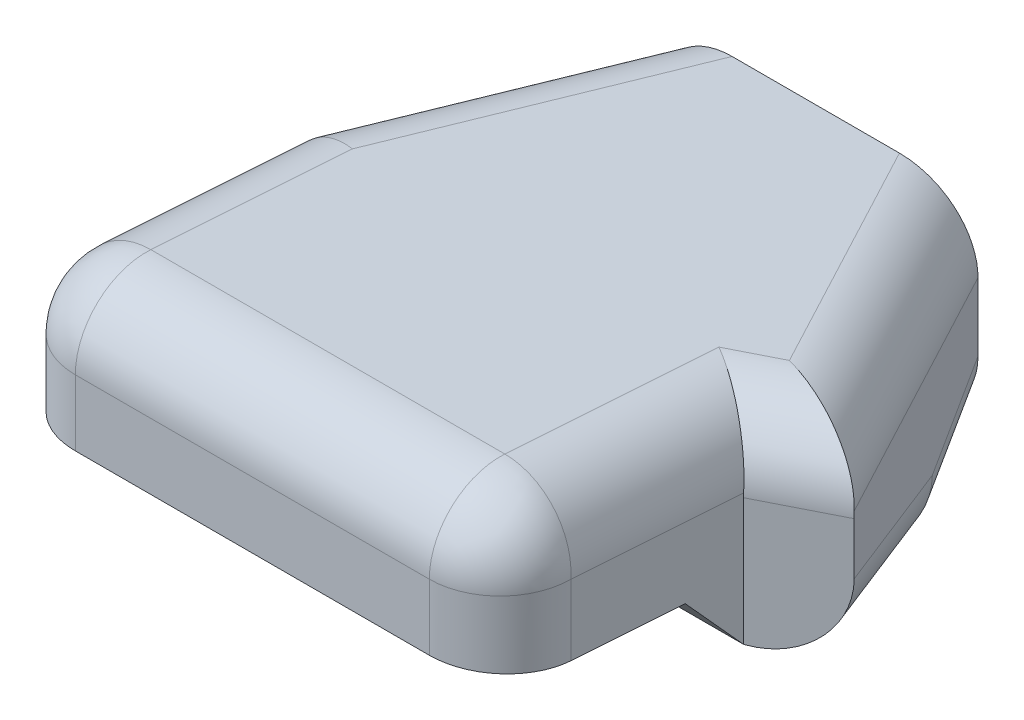
ISO-10303-21;
HEADER;
FILE_DESCRIPTION(('STEP AP214'),'2;1');
FILE_NAME('part.step','',(''),(''),'','','');
FILE_SCHEMA(('AUTOMOTIVE_DESIGN { 1 0 10303 214 1 1 1 1 }'));
ENDSEC;
DATA;
#1=APPLICATION_CONTEXT('core data for automotive mechanical design processes');
#2=APPLICATION_PROTOCOL_DEFINITION('international standard','automotive_design',2000,#1);
#3=PRODUCT_CONTEXT('',#1,'mechanical');
#4=PRODUCT('Part','Part','',(#3));
#5=PRODUCT_RELATED_PRODUCT_CATEGORY('part','',(#4));
#6=PRODUCT_DEFINITION_FORMATION('','',#4);
#7=PRODUCT_DEFINITION_CONTEXT('part definition',#1,'design');
#8=PRODUCT_DEFINITION('design','',#6,#7);
#9=PRODUCT_DEFINITION_SHAPE('','',#8);
#10=(LENGTH_UNIT() NAMED_UNIT(*) SI_UNIT(.MILLI.,.METRE.));
#11=(NAMED_UNIT(*) PLANE_ANGLE_UNIT() SI_UNIT($,.RADIAN.));
#12=(NAMED_UNIT(*) SI_UNIT($,.STERADIAN.) SOLID_ANGLE_UNIT());
#13=UNCERTAINTY_MEASURE_WITH_UNIT(LENGTH_MEASURE(1.E-05),#10,'distance_accuracy_value','');
#14=(GEOMETRIC_REPRESENTATION_CONTEXT(3) GLOBAL_UNCERTAINTY_ASSIGNED_CONTEXT((#13)) GLOBAL_UNIT_ASSIGNED_CONTEXT((#10,
#11,#12)) REPRESENTATION_CONTEXT('',''));
#15=CARTESIAN_POINT('',(0.,0.,0.));
#16=DIRECTION('',(0.,0.,1.));
#17=DIRECTION('',(1.,0.,0.));
#18=AXIS2_PLACEMENT_3D('',#15,#16,#17);
#19=CARTESIAN_POINT('',(-44.45,48.26,50.8));
#20=DIRECTION('',(1.,0.,0.));
#21=DIRECTION('',(0.,0.,1.));
#22=AXIS2_PLACEMENT_3D('',#19,#20,#21);
#23=PLANE('',#22);
#24=DIRECTION('',(0.,0.741365955623749,0.671100975891173));
#25=VECTOR('',#24,1.);
#26=CARTESIAN_POINT('',(-44.45,27.062088622232,74.2173550484524));
#27=LINE('',#26,#25);
#28=CARTESIAN_POINT('',(-44.45,15.2004808970908,63.4799635353998));
#29=VERTEX_POINT('',#28);
#30=CARTESIAN_POINT('',(-44.45,20.6329834358397,68.3975858346573));
#31=VERTEX_POINT('',#30);
#32=EDGE_CURVE('E330',#29,#31,#27,.T.);
#33=ORIENTED_EDGE('',*,*,#32,.T.);
#34=DIRECTION('',(0.,0.0669235621427186,0.997758105369297));
#35=VECTOR('',#34,1.);
#36=CARTESIAN_POINT('',(-44.45,19.5816654348561,52.7235687438587));
#37=LINE('',#36,#35);
#38=CARTESIAN_POINT('',(-44.45,22.008161027569,88.9));
#39=VERTEX_POINT('',#38);
#40=EDGE_CURVE('E327',#31,#39,#37,.T.);
#41=ORIENTED_EDGE('',*,*,#40,.T.);
#42=DIRECTION('',(0.,-1.,0.));
#43=VECTOR('',#42,1.);
#44=CARTESIAN_POINT('',(-44.45,48.26,88.9));
#45=LINE('',#44,#43);
#46=CARTESIAN_POINT('',(-44.45,34.6796249909718,88.9));
#47=VERTEX_POINT('',#46);
#48=EDGE_CURVE('E383',#47,#39,#45,.T.);
#49=ORIENTED_EDGE('',*,*,#48,.F.);
#50=DIRECTION('',(0.,-0.0669235621427186,-0.997758105369297));
#51=VECTOR('',#50,1.);
#52=CARTESIAN_POINT('',(-44.45,35.5884720618099,102.449929239213));
#53=LINE('',#52,#51);
#54=CARTESIAN_POINT('',(-44.45,32.1241080736787,50.8));
#55=VERTEX_POINT('',#54);
#56=EDGE_CURVE('E380',#55,#47,#53,.F.);
#57=ORIENTED_EDGE('',*,*,#56,.F.);
#58=DIRECTION('',(0.,-1.,0.));
#59=VECTOR('',#58,1.);
#60=CARTESIAN_POINT('',(-44.45,48.26,50.8));
#61=LINE('',#60,#59);
#62=CARTESIAN_POINT('',(-44.45,21.3334287185706,50.8));
#63=VERTEX_POINT('',#62);
#64=EDGE_CURVE('E345',#55,#63,#61,.T.);
#65=ORIENTED_EDGE('',*,*,#64,.T.);
#66=CARTESIAN_POINT('',(-44.45,32.1617140550632,93.3781587201701));
#67=DIRECTION('',(-1.,0.,0.));
#68=DIRECTION('',(0.,-0.268871544476507,-0.963176044433632));
#69=AXIS2_PLACEMENT_3D('',#66,#67,#68);
#70=ELLIPSE('',#69,44.0636100522988,12.7);
#71=EDGE_CURVE('E438',#29,#63,#70,.F.);
#72=ORIENTED_EDGE('',*,*,#71,.F.);
#73=EDGE_LOOP('',(#33,#41,#49,#57,#65,#72));
#74=FACE_BOUND('',#73,.T.);
#75=ADVANCED_FACE('F47',(#74),#23,.F.);
#76=CARTESIAN_POINT('',(-28.575,48.26,0.));
#77=DIRECTION('',(0.95447997803503,0.,0.298274993135947));
#78=DIRECTION('',(-0.298274993135947,0.,0.95447997803503));
#79=AXIS2_PLACEMENT_3D('',#76,#77,#78);
#80=PLANE('',#79);
#81=ORIENTED_EDGE('',*,*,#64,.F.);
#82=CARTESIAN_POINT('',(-31.75,29.3982233618993,10.16));
#83=DIRECTION('',(-0.95447997803503,0.,-0.298274993135947));
#84=DIRECTION('',(-0.297541229968866,0.0700998795093561,0.952131935900371));
#85=AXIS2_PLACEMENT_3D('',#82,#83,#84);
#86=ELLIPSE('',#85,42.6738289481605,12.7);
#87=CARTESIAN_POINT('',(-44.4474694857825,32.3776471963871,50.791902354504));
#88=VERTEX_POINT('',#87);
#89=EDGE_CURVE('E408',#88,#55,#86,.F.);
#90=ORIENTED_EDGE('',*,*,#89,.F.);
#91=DIRECTION('',(0.297665602820913,-0.0638899303899297,-0.952529929026922));
#92=VECTOR('',#91,1.);
#93=CARTESIAN_POINT('',(-44.6872370991244,32.4291100996618,51.5591587171979));
#94=LINE('',#93,#92);
#95=CARTESIAN_POINT('',(-28.575,28.9708344476093,0.));
#96=VERTEX_POINT('',#95);
#97=EDGE_CURVE('E405',#96,#88,#94,.F.);
#98=ORIENTED_EDGE('',*,*,#97,.F.);
#99=DIRECTION('',(0.,-1.,0.));
#100=VECTOR('',#99,1.);
#101=CARTESIAN_POINT('',(-28.575,48.26,0.));
#102=LINE('',#101,#100);
#103=CARTESIAN_POINT('',(-28.575,17.4265217154074,0.));
#104=VERTEX_POINT('',#103);
#105=EDGE_CURVE('E342',#96,#104,#102,.T.);
#106=ORIENTED_EDGE('',*,*,#105,.T.);
#107=DIRECTION('',(-0.292654151843761,-0.193219752801737,0.936493285900035));
#108=VECTOR('',#107,1.);
#109=CARTESIAN_POINT('',(-29.2640722899567,16.971573864201,2.2050313278613));
#110=LINE('',#109,#108);
#111=CARTESIAN_POINT('',(-35.1883635531592,13.0601648300568,21.1627633701095));
#112=VERTEX_POINT('',#111);
#113=EDGE_CURVE('E441',#112,#104,#110,.F.);
#114=ORIENTED_EDGE('',*,*,#113,.F.);
#115=DIRECTION('',(-0.288219689329278,0.257461795372023,0.922303005853689));
#116=VECTOR('',#115,1.);
#117=CARTESIAN_POINT('',(-35.4555907010625,13.29887434165,22.0178902434001));
#118=LINE('',#117,#116);
#119=EDGE_CURVE('E444',#63,#112,#118,.F.);
#120=ORIENTED_EDGE('',*,*,#119,.F.);
#121=EDGE_LOOP('',(#81,#90,#98,#106,#114,#120));
#122=FACE_BOUND('',#121,.T.);
#123=ADVANCED_FACE('F507',(#122),#80,.F.);
#124=CARTESIAN_POINT('',(28.575,48.26,0.));
#125=DIRECTION('',(0.,0.,1.));
#126=DIRECTION('',(-1.,0.,0.));
#127=AXIS2_PLACEMENT_3D('',#124,#125,#126);
#128=PLANE('',#127);
#129=DIRECTION('',(0.,1.,0.));
#130=VECTOR('',#129,1.);
#131=CARTESIAN_POINT('',(-10.4193083176777,18.3429414445207,0.));
#132=LINE('',#131,#130);
#133=CARTESIAN_POINT('',(-10.4193083176777,18.3429414445207,0.));
#134=VERTEX_POINT('',#133);
#135=CARTESIAN_POINT('',(-10.4193083176777,28.3429414445207,0.));
#136=VERTEX_POINT('',#135);
#137=EDGE_CURVE('E247',#134,#136,#132,.T.);
#138=ORIENTED_EDGE('',*,*,#137,.F.);
#139=DIRECTION('',(-1.,0.,0.));
#140=VECTOR('',#139,1.);
#141=CARTESIAN_POINT('',(9.58069168232234,18.3429414445207,0.));
#142=LINE('',#141,#140);
#143=CARTESIAN_POINT('',(-9.89583157885465,18.3429414445207,0.));
#144=VERTEX_POINT('',#143);
#145=EDGE_CURVE('E260',#144,#134,#142,.T.);
#146=ORIENTED_EDGE('',*,*,#145,.F.);
#147=DIRECTION('',(0.,1.,0.));
#148=VECTOR('',#147,1.);
#149=CARTESIAN_POINT('',(-9.89583157885465,0.,0.));
#150=LINE('',#149,#148);
#151=CARTESIAN_POINT('',(-9.89583157885465,18.3063755872149,0.));
#152=VERTEX_POINT('',#151);
#153=EDGE_CURVE('E282',#152,#144,#150,.T.);
#154=ORIENTED_EDGE('',*,*,#153,.F.);
#155=DIRECTION('',(1.,0.,0.));
#156=VECTOR('',#155,1.);
#157=CARTESIAN_POINT('',(0.,18.3063755872149,0.));
#158=LINE('',#157,#156);
#159=CARTESIAN_POINT('',(10.1041684211454,18.3063755872149,0.));
#160=VERTEX_POINT('',#159);
#161=EDGE_CURVE('E278',#152,#160,#158,.T.);
#162=ORIENTED_EDGE('',*,*,#161,.T.);
#163=DIRECTION('',(0.,1.,0.));
#164=VECTOR('',#163,1.);
#165=CARTESIAN_POINT('',(10.1041684211454,0.,0.));
#166=LINE('',#165,#164);
#167=CARTESIAN_POINT('',(10.1041684211454,28.3063755872149,0.));
#168=VERTEX_POINT('',#167);
#169=EDGE_CURVE('E290',#160,#168,#166,.T.);
#170=ORIENTED_EDGE('',*,*,#169,.T.);
#171=DIRECTION('',(1.,0.,0.));
#172=VECTOR('',#171,1.);
#173=CARTESIAN_POINT('',(0.,28.3063755872149,0.));
#174=LINE('',#173,#172);
#175=CARTESIAN_POINT('',(9.58069168232234,28.3063755872149,0.));
#176=VERTEX_POINT('',#175);
#177=EDGE_CURVE('E293',#176,#168,#174,.T.);
#178=ORIENTED_EDGE('',*,*,#177,.F.);
#179=DIRECTION('',(0.,-1.,0.));
#180=VECTOR('',#179,1.);
#181=CARTESIAN_POINT('',(9.58069168232234,18.3429414445207,0.));
#182=LINE('',#181,#180);
#183=CARTESIAN_POINT('',(9.58069168232234,28.3429414445207,0.));
#184=VERTEX_POINT('',#183);
#185=EDGE_CURVE('E262',#184,#176,#182,.T.);
#186=ORIENTED_EDGE('',*,*,#185,.F.);
#187=DIRECTION('',(1.,0.,0.));
#188=VECTOR('',#187,1.);
#189=CARTESIAN_POINT('',(9.58069168232234,28.3429414445207,0.));
#190=LINE('',#189,#188);
#191=EDGE_CURVE('E268',#136,#184,#190,.T.);
#192=ORIENTED_EDGE('',*,*,#191,.F.);
#193=EDGE_LOOP('',(#138,#146,#154,#162,#170,#178,#186,#192));
#194=FACE_BOUND('',#193,.T.);
#195=ORIENTED_EDGE('',*,*,#105,.F.);
#196=CARTESIAN_POINT('',(-15.2693253999468,28.7167521839545,0.));
#197=DIRECTION('',(0.,0.,-1.));
#198=DIRECTION('',(-0.977732072803991,0.209857079486041,0.));
#199=AXIS2_PLACEMENT_3D('',#196,#197,#198);
#200=ELLIPSE('',#199,13.3329143924895,12.7);
#201=CARTESIAN_POINT('',(-15.5349282872007,41.4452882205517,0.));
#202=VERTEX_POINT('',#201);
#203=EDGE_CURVE('E373',#202,#96,#200,.F.);
#204=ORIENTED_EDGE('',*,*,#203,.F.);
#205=DIRECTION('',(-1.,0.,0.));
#206=VECTOR('',#205,1.);
#207=CARTESIAN_POINT('',(82.55,41.4452882205517,0.));
#208=LINE('',#207,#206);
#209=CARTESIAN_POINT('',(14.4817721449502,41.4452882205517,0.));
#210=VERTEX_POINT('',#209);
#211=EDGE_CURVE('E318',#210,#202,#208,.T.);
#212=ORIENTED_EDGE('',*,*,#211,.F.);
#213=CARTESIAN_POINT('',(14.0036869478931,28.7167521839545,0.));
#214=DIRECTION('',(0.,0.,-1.));
#215=DIRECTION('',(-0.992965534941179,-0.118403743264215,0.));
#216=AXIS2_PLACEMENT_3D('',#213,#214,#215);
#217=ELLIPSE('',#216,14.5961910681332,12.7);
#218=CARTESIAN_POINT('',(28.575,29.1343758145459,0.));
#219=VERTEX_POINT('',#218);
#220=EDGE_CURVE('E375',#219,#210,#217,.F.);
#221=ORIENTED_EDGE('',*,*,#220,.F.);
#222=DIRECTION('',(0.,-1.,0.));
#223=VECTOR('',#222,1.);
#224=CARTESIAN_POINT('',(28.575,48.26,0.));
#225=LINE('',#224,#223);
#226=CARTESIAN_POINT('',(28.575,16.9234606655006,0.));
#227=VERTEX_POINT('',#226);
#228=EDGE_CURVE('E339',#219,#227,#225,.T.);
#229=ORIENTED_EDGE('',*,*,#228,.T.);
#230=CARTESIAN_POINT('',(14.0036869478931,18.2080908847934,0.));
#231=DIRECTION('',(0.,0.,-1.));
#232=DIRECTION('',(0.938837131961839,-0.344361495596806,0.));
#233=AXIS2_PLACEMENT_3D('',#230,#231,#232);
#234=ELLIPSE('',#233,14.8050370544065,12.7);
#235=CARTESIAN_POINT('',(15.4471999259788,5.24059466848969,0.));
#236=VERTEX_POINT('',#235);
#237=EDGE_CURVE('E458',#236,#227,#234,.F.);
#238=ORIENTED_EDGE('',*,*,#237,.F.);
#239=DIRECTION('',(-1.,0.,0.));
#240=VECTOR('',#239,1.);
#241=CARTESIAN_POINT('',(82.55,5.24059466848969,0.));
#242=LINE('',#241,#240);
#243=CARTESIAN_POINT('',(-16.0712770544389,5.24059466848969,0.));
#244=VERTEX_POINT('',#243);
#245=EDGE_CURVE('E303',#236,#244,#242,.T.);
#246=ORIENTED_EDGE('',*,*,#245,.T.);
#247=CARTESIAN_POINT('',(-15.2693253999468,18.2080908847934,0.));
#248=DIRECTION('',(0.,0.,-1.));
#249=DIRECTION('',(0.834520233187556,0.550977295721509,0.));
#250=AXIS2_PLACEMENT_3D('',#247,#248,#249);
#251=ELLIPSE('',#250,13.5612290992502,12.7);
#252=EDGE_CURVE('E461',#104,#244,#251,.F.);
#253=ORIENTED_EDGE('',*,*,#252,.F.);
#254=EDGE_LOOP('',(#195,#204,#212,#221,#229,#238,#246,#253));
#255=FACE_BOUND('',#254,.T.);
#256=ADVANCED_FACE('F483',(#194,#255),#128,.F.);
#257=CARTESIAN_POINT('',(57.15,48.26,50.8));
#258=DIRECTION('',(-0.871575537124549,0.,0.490261239632559));
#259=DIRECTION('',(-0.490261239632559,0.,-0.871575537124549));
#260=AXIS2_PLACEMENT_3D('',#257,#258,#259);
#261=PLANE('',#260);
#262=DIRECTION('',(-0.482521588682802,0.176986881195609,-0.857816157658315));
#263=VECTOR('',#262,1.);
#264=CARTESIAN_POINT('',(43.8602166520565,11.3169077420727,27.1737184925448));
#265=LINE('',#264,#263);
#266=CARTESIAN_POINT('',(39.1075526472764,13.0601648300568,18.7245380396025));
#267=VERTEX_POINT('',#266);
#268=EDGE_CURVE('E464',#227,#267,#265,.F.);
#269=ORIENTED_EDGE('',*,*,#268,.F.);
#270=ORIENTED_EDGE('',*,*,#228,.F.);
#271=DIRECTION('',(0.489425629375078,0.0583603604840991,0.870090007777917));
#272=VECTOR('',#271,1.);
#273=CARTESIAN_POINT('',(28.9266372824396,29.1763059410679,0.625132946559234));
#274=LINE('',#273,#272);
#275=CARTESIAN_POINT('',(57.1241369132409,32.5386477238328,50.754021179095));
#276=VERTEX_POINT('',#275);
#277=EDGE_CURVE('E371',#276,#219,#274,.F.);
#278=ORIENTED_EDGE('',*,*,#277,.F.);
#279=CARTESIAN_POINT('',(50.9236822566665,31.3816660637385,39.7309906785182));
#280=DIRECTION('',(0.871575537124549,0.,-0.490261239632559));
#281=DIRECTION('',(0.,-1.,0.));
#282=AXIS2_PLACEMENT_3D('',#279,#280,#281);
#283=ELLIPSE('',#282,12.7068646603648,12.7);
#284=CARTESIAN_POINT('',(57.15,31.3816660637385,50.8));
#285=VERTEX_POINT('',#284);
#286=EDGE_CURVE('E368',#285,#276,#283,.F.);
#287=ORIENTED_EDGE('',*,*,#286,.F.);
#288=DIRECTION('',(0.,-1.,0.));
#289=VECTOR('',#288,1.);
#290=CARTESIAN_POINT('',(57.15,48.26,50.8));
#291=LINE('',#290,#289);
#292=CARTESIAN_POINT('',(57.15,22.0140617286873,50.8));
#293=VERTEX_POINT('',#292);
#294=EDGE_CURVE('E336',#285,#293,#291,.T.);
#295=ORIENTED_EDGE('',*,*,#294,.T.);
#296=DIRECTION('',(-0.476364625502872,-0.23640472157252,-0.84687044533844));
#297=VECTOR('',#296,1.);
#298=CARTESIAN_POINT('',(55.4693780752367,21.1800221360687,47.8122276893097));
#299=LINE('',#298,#297);
#300=EDGE_CURVE('E56',#267,#293,#299,.F.);
#301=ORIENTED_EDGE('',*,*,#300,.F.);
#302=EDGE_LOOP('',(#269,#270,#278,#287,#295,#301));
#303=FACE_BOUND('',#302,.T.);
#304=ADVANCED_FACE('F489',(#303),#261,.F.);
#305=CARTESIAN_POINT('',(57.15,48.26,50.8));
#306=DIRECTION('',(-0.490261239632559,0.,-0.871575537124549));
#307=DIRECTION('',(0.871575537124549,0.,-0.490261239632559));
#308=AXIS2_PLACEMENT_3D('',#305,#306,#307);
#309=PLANE('',#308);
#310=ORIENTED_EDGE('',*,*,#294,.F.);
#311=DIRECTION('',(-0.871104683754771,0.0328659855718789,0.489996384612059));
#312=VECTOR('',#311,1.);
#313=CARTESIAN_POINT('',(56.76432975166,31.3962170506104,51.0169395146912));
#314=LINE('',#313,#312);
#315=CARTESIAN_POINT('',(44.45,31.8608254857309,57.94375));
#316=VERTEX_POINT('',#315);
#317=EDGE_CURVE('E378',#316,#285,#314,.F.);
#318=ORIENTED_EDGE('',*,*,#317,.F.);
#319=DIRECTION('',(0.,-1.,0.));
#320=VECTOR('',#319,1.);
#321=CARTESIAN_POINT('',(44.45,48.26,57.94375));
#322=LINE('',#321,#320);
#323=CARTESIAN_POINT('',(44.45,9.08461996758088,57.94375));
#324=VERTEX_POINT('',#323);
#325=EDGE_CURVE('E333',#316,#324,#322,.T.);
#326=ORIENTED_EDGE('',*,*,#325,.T.);
#327=DIRECTION('',(0.863526210364251,-0.13559298459543,-0.485733493329891));
#328=VECTOR('',#327,1.);
#329=CARTESIAN_POINT('',(52.329534026568,7.84735638129908,53.5115121100555));
#330=LINE('',#329,#328);
#331=CARTESIAN_POINT('',(44.6219037926469,9.0576272161988,57.8470541166361));
#332=VERTEX_POINT('',#331);
#333=EDGE_CURVE('E306',#324,#332,#330,.T.);
#334=ORIENTED_EDGE('',*,*,#333,.T.);
#335=CARTESIAN_POINT('',(46.0809906785182,22.0140617286873,57.0263177433335));
#336=DIRECTION('',(0.490261239632559,0.,0.871575537124549));
#337=DIRECTION('',(0.,1.,0.));
#338=AXIS2_PLACEMENT_3D('',#335,#336,#337);
#339=ELLIPSE('',#338,13.0704872066449,12.7);
#340=EDGE_CURVE('E11',#293,#332,#339,.F.);
#341=ORIENTED_EDGE('',*,*,#340,.F.);
#342=EDGE_LOOP('',(#310,#318,#326,#334,#341));
#343=FACE_BOUND('',#342,.T.);
#344=ADVANCED_FACE('F494',(#343),#309,.F.);
#345=CARTESIAN_POINT('',(44.45,48.26,57.94375));
#346=DIRECTION('',(-1.,0.,0.));
#347=DIRECTION('',(0.,0.,-1.));
#348=AXIS2_PLACEMENT_3D('',#345,#346,#347);
#349=PLANE('',#348);
#350=DIRECTION('',(0.,-0.0669235621427186,-0.997758105369297));
#351=VECTOR('',#350,1.);
#352=CARTESIAN_POINT('',(44.45,20.0586788152768,59.835323579464));
#353=LINE('',#352,#351);
#354=CARTESIAN_POINT('',(44.45,22.008161027569,88.9));
#355=VERTEX_POINT('',#354);
#356=CARTESIAN_POINT('',(44.45,20.6329834358397,68.3975858346573));
#357=VERTEX_POINT('',#356);
#358=EDGE_CURVE('E324',#355,#357,#353,.T.);
#359=ORIENTED_EDGE('',*,*,#358,.T.);
#360=DIRECTION('',(0.,-0.741365955623749,-0.671100975891173));
#361=VECTOR('',#360,1.);
#362=CARTESIAN_POINT('',(44.45,30.616328677508,77.4347323120743));
#363=LINE('',#362,#361);
#364=EDGE_CURVE('E348',#357,#324,#363,.T.);
#365=ORIENTED_EDGE('',*,*,#364,.T.);
#366=ORIENTED_EDGE('',*,*,#325,.F.);
#367=CARTESIAN_POINT('',(44.45,31.6259121935233,43.3724369478931));
#368=DIRECTION('',(1.,0.,0.));
#369=DIRECTION('',(0.,-0.0669235621427186,-0.997758105369297));
#370=AXIS2_PLACEMENT_3D('',#367,#368,#369);
#371=ELLIPSE('',#370,14.5791892029078,12.7);
#372=CARTESIAN_POINT('',(44.45,32.6016034681345,57.9189411448069));
#373=VERTEX_POINT('',#372);
#374=EDGE_CURVE('E410',#373,#316,#371,.T.);
#375=ORIENTED_EDGE('',*,*,#374,.F.);
#376=DIRECTION('',(0.,0.0669235621427186,0.997758105369297));
#377=VECTOR('',#376,1.);
#378=CARTESIAN_POINT('',(44.45,32.6602755940782,58.7936792392125));
#379=LINE('',#378,#377);
#380=CARTESIAN_POINT('',(44.45,34.6796249909718,88.9));
#381=VERTEX_POINT('',#380);
#382=EDGE_CURVE('E399',#381,#373,#379,.F.);
#383=ORIENTED_EDGE('',*,*,#382,.F.);
#384=DIRECTION('',(0.,-1.,0.));
#385=VECTOR('',#384,1.);
#386=CARTESIAN_POINT('',(44.45,48.26,88.9));
#387=LINE('',#386,#385);
#388=EDGE_CURVE('E402',#355,#381,#387,.F.);
#389=ORIENTED_EDGE('',*,*,#388,.F.);
#390=EDGE_LOOP('',(#359,#365,#366,#375,#383,#389));
#391=FACE_BOUND('',#390,.T.);
#392=ADVANCED_FACE('F523',(#391),#349,.F.);
#393=CARTESIAN_POINT('',(-44.45,48.26,101.6));
#394=DIRECTION('',(0.,0.,-1.));
#395=DIRECTION('',(1.,0.,0.));
#396=AXIS2_PLACEMENT_3D('',#393,#394,#395);
#397=PLANE('',#396);
#398=DIRECTION('',(-1.,0.,0.));
#399=VECTOR('',#398,1.);
#400=CARTESIAN_POINT('',(82.55,22.86,101.6));
#401=LINE('',#400,#399);
#402=CARTESIAN_POINT('',(31.75,22.86,101.6));
#403=VERTEX_POINT('',#402);
#404=CARTESIAN_POINT('',(-31.75,22.86,101.6));
#405=VERTEX_POINT('',#404);
#406=EDGE_CURVE('E315',#403,#405,#401,.T.);
#407=ORIENTED_EDGE('',*,*,#406,.F.);
#408=DIRECTION('',(0.,-1.,0.));
#409=VECTOR('',#408,1.);
#410=CARTESIAN_POINT('',(31.75,48.26,101.6));
#411=LINE('',#410,#409);
#412=CARTESIAN_POINT('',(31.75,34.6796249909718,101.6));
#413=VERTEX_POINT('',#412);
#414=EDGE_CURVE('E393',#413,#403,#411,.T.);
#415=ORIENTED_EDGE('',*,*,#414,.F.);
#416=DIRECTION('',(-1.,0.,0.));
#417=VECTOR('',#416,1.);
#418=CARTESIAN_POINT('',(44.45,34.6796249909718,101.6));
#419=LINE('',#418,#417);
#420=CARTESIAN_POINT('',(-31.75,34.6796249909718,101.6));
#421=VERTEX_POINT('',#420);
#422=EDGE_CURVE('E390',#421,#413,#419,.F.);
#423=ORIENTED_EDGE('',*,*,#422,.F.);
#424=DIRECTION('',(0.,-1.,0.));
#425=VECTOR('',#424,1.);
#426=CARTESIAN_POINT('',(-31.75,48.26,101.6));
#427=LINE('',#426,#425);
#428=EDGE_CURVE('E396',#405,#421,#427,.F.);
#429=ORIENTED_EDGE('',*,*,#428,.F.);
#430=EDGE_LOOP('',(#407,#415,#423,#429));
#431=FACE_BOUND('',#430,.T.);
#432=ADVANCED_FACE('F590',(#431),#397,.F.);
#433=CARTESIAN_POINT('',(82.55,41.4452882205517,0.));
#434=DIRECTION('',(0.,0.997758105369297,-0.0669235621427186));
#435=DIRECTION('',(0.,-0.0669235621427186,-0.997758105369297));
#436=AXIS2_PLACEMENT_3D('',#433,#434,#435);
#437=PLANE('',#436);
#438=ORIENTED_EDGE('',*,*,#211,.T.);
#439=DIRECTION('',(0.297665602820913,-0.0638899303899297,-0.952529929026922));
#440=VECTOR('',#439,1.);
#441=CARTESIAN_POINT('',(-16.6903413780795,41.6932821481277,3.69732189081193));
#442=LINE('',#441,#440);
#443=CARTESIAN_POINT('',(-31.75,44.9256359435694,51.8882294809576));
#444=VERTEX_POINT('',#443);
#445=EDGE_CURVE('E351',#444,#202,#442,.T.);
#446=ORIENTED_EDGE('',*,*,#445,.F.);
#447=DIRECTION('',(0.,-0.0669235621427186,-0.997758105369297));
#448=VECTOR('',#447,1.);
#449=CARTESIAN_POINT('',(-31.75,44.8526441102758,50.8));
#450=LINE('',#449,#448);
#451=CARTESIAN_POINT('',(-31.75,47.3511529291619,88.0500707607874));
#452=VERTEX_POINT('',#451);
#453=EDGE_CURVE('E353',#452,#444,#450,.T.);
#454=ORIENTED_EDGE('',*,*,#453,.F.);
#455=DIRECTION('',(-1.,0.,0.));
#456=VECTOR('',#455,1.);
#457=CARTESIAN_POINT('',(-44.45,47.3511529291619,88.0500707607874));
#458=LINE('',#457,#456);
#459=CARTESIAN_POINT('',(31.75,47.3511529291619,88.0500707607874));
#460=VERTEX_POINT('',#459);
#461=EDGE_CURVE('E356',#460,#452,#458,.T.);
#462=ORIENTED_EDGE('',*,*,#461,.F.);
#463=DIRECTION('',(0.,0.0669235621427186,0.997758105369297));
#464=VECTOR('',#463,1.);
#465=CARTESIAN_POINT('',(31.75,48.26,101.6));
#466=LINE('',#465,#464);
#467=CARTESIAN_POINT('',(31.75,44.7765995537058,49.6662577086806));
#468=VERTEX_POINT('',#467);
#469=EDGE_CURVE('E359',#468,#460,#466,.T.);
#470=ORIENTED_EDGE('',*,*,#469,.F.);
#471=DIRECTION('',(-0.871104683754771,0.0328659855718789,0.489996384612059));
#472=VECTOR('',#471,1.);
#473=CARTESIAN_POINT('',(37.8380120083265,44.546904410793,46.2417509539969));
#474=LINE('',#473,#472);
#475=CARTESIAN_POINT('',(39.8546729351847,44.4708176325199,45.1073791826392));
#476=VERTEX_POINT('',#475);
#477=EDGE_CURVE('E362',#476,#468,#474,.T.);
#478=ORIENTED_EDGE('',*,*,#477,.F.);
#479=DIRECTION('',(0.489425629375078,0.0583603604840991,0.870090007777917));
#480=VECTOR('',#479,1.);
#481=CARTESIAN_POINT('',(46.4326279609578,45.2551897689821,56.8015214506802));
#482=LINE('',#481,#480);
#483=EDGE_CURVE('E365',#210,#476,#482,.T.);
#484=ORIENTED_EDGE('',*,*,#483,.F.);
#485=EDGE_LOOP('',(#438,#446,#454,#462,#470,#478,#484));
#486=FACE_BOUND('',#485,.T.);
#487=ADVANCED_FACE('F513',(#486),#437,.T.);
#488=CARTESIAN_POINT('',(82.55,9.08461996758088,57.94375));
#489=DIRECTION('',(0.,-0.671100975891173,0.741365955623749));
#490=DIRECTION('',(0.,0.741365955623749,0.671100975891173));
#491=AXIS2_PLACEMENT_3D('',#488,#489,#490);
#492=PLANE('',#491);
#493=DIRECTION('',(-1.,0.,0.));
#494=VECTOR('',#493,1.);
#495=CARTESIAN_POINT('',(82.55,9.08461996758088,57.94375));
#496=LINE('',#495,#494);
#497=CARTESIAN_POINT('',(-32.3096633328057,9.08461996758088,57.94375));
#498=VERTEX_POINT('',#497);
#499=EDGE_CURVE('E310',#324,#498,#496,.T.);
#500=ORIENTED_EDGE('',*,*,#499,.F.);
#501=ORIENTED_EDGE('',*,*,#364,.F.);
#502=DIRECTION('',(-1.,0.,0.));
#503=VECTOR('',#502,1.);
#504=CARTESIAN_POINT('',(82.55,20.6329834358397,68.3975858346573));
#505=LINE('',#504,#503);
#506=EDGE_CURVE('E313',#357,#31,#505,.T.);
#507=ORIENTED_EDGE('',*,*,#506,.T.);
#508=ORIENTED_EDGE('',*,*,#32,.F.);
#509=CARTESIAN_POINT('',(-38.3679436075628,26.7287154906875,73.9155782643712));
#510=DIRECTION('',(0.,0.671100975891173,-0.741365955623749));
#511=DIRECTION('',(0.335298286231136,-0.69844977841403,-0.632252296384803));
#512=AXIS2_PLACEMENT_3D('',#509,#510,#511);
#513=ELLIPSE('',#512,24.8541439853702,12.7);
#514=EDGE_CURVE('E436',#498,#29,#513,.T.);
#515=ORIENTED_EDGE('',*,*,#514,.F.);
#516=EDGE_LOOP('',(#500,#501,#507,#508,#515));
#517=FACE_BOUND('',#516,.T.);
#518=ADVANCED_FACE('F528',(#517),#492,.T.);
#519=CARTESIAN_POINT('',(82.55,20.6329834358397,68.3975858346573));
#520=DIRECTION('',(0.,-0.997758105369297,0.0669235621427186));
#521=DIRECTION('',(0.,0.0669235621427186,0.997758105369297));
#522=AXIS2_PLACEMENT_3D('',#519,#520,#521);
#523=PLANE('',#522);
#524=ORIENTED_EDGE('',*,*,#40,.F.);
#525=ORIENTED_EDGE('',*,*,#506,.F.);
#526=ORIENTED_EDGE('',*,*,#358,.F.);
#527=CARTESIAN_POINT('',(31.75,22.008161027569,88.9));
#528=DIRECTION('',(0.,0.997758105369297,-0.0669235621427186));
#529=DIRECTION('',(0.,-0.0669235621427186,-0.997758105369297));
#530=AXIS2_PLACEMENT_3D('',#527,#528,#529);
#531=ELLIPSE('',#530,12.7285360365972,12.7);
#532=EDGE_CURVE('E386',#403,#355,#531,.T.);
#533=ORIENTED_EDGE('',*,*,#532,.F.);
#534=ORIENTED_EDGE('',*,*,#406,.T.);
#535=CARTESIAN_POINT('',(-31.75,22.008161027569,88.9));
#536=DIRECTION('',(0.,0.997758105369297,-0.0669235621427186));
#537=DIRECTION('',(0.,-0.0669235621427186,-0.997758105369297));
#538=AXIS2_PLACEMENT_3D('',#535,#536,#537);
#539=ELLIPSE('',#538,12.7285360365972,12.7);
#540=EDGE_CURVE('E388',#39,#405,#539,.T.);
#541=ORIENTED_EDGE('',*,*,#540,.F.);
#542=EDGE_LOOP('',(#524,#525,#526,#533,#534,#541));
#543=FACE_BOUND('',#542,.T.);
#544=ADVANCED_FACE('F553',(#543),#523,.T.);
#545=CARTESIAN_POINT('',(82.55,5.24059466848969,0.));
#546=DIRECTION('',(0.,-0.979371791451354,-0.202066558612172));
#547=DIRECTION('',(0.,-0.202066558612172,0.979371791451354));
#548=AXIS2_PLACEMENT_3D('',#545,#546,#547);
#549=PLANE('',#548);
#550=DIRECTION('',(-0.292654151843761,-0.193219752801737,0.936493285900035));
#551=VECTOR('',#550,1.);
#552=CARTESIAN_POINT('',(-25.0796765689118,-0.707042555720922,28.8268784463132));
#553=LINE('',#552,#551);
#554=CARTESIAN_POINT('',(-23.9250323951995,0.0552909372881425,25.1320170904338));
#555=VERTEX_POINT('',#554);
#556=EDGE_CURVE('E452',#244,#555,#553,.T.);
#557=ORIENTED_EDGE('',*,*,#556,.F.);
#558=ORIENTED_EDGE('',*,*,#245,.F.);
#559=DIRECTION('',(-0.482521588682802,0.176986881195609,-0.857816157658315));
#560=VECTOR('',#559,1.);
#561=CARTESIAN_POINT('',(18.5037073305747,4.11948065913016,5.43379094150374));
#562=LINE('',#561,#560);
#563=CARTESIAN_POINT('',(29.3273892594226,0.149399832551079,24.6758921483445));
#564=VERTEX_POINT('',#563);
#565=EDGE_CURVE('E447',#564,#236,#562,.T.);
#566=ORIENTED_EDGE('',*,*,#565,.F.);
#567=CARTESIAN_POINT('',(13.0135936079506,5.60375672473534,-1.76016593767556));
#568=DIRECTION('',(0.,0.979371791451354,0.202066558612172));
#569=DIRECTION('',(0.520416304141384,-0.172547197232235,0.83629799420489));
#570=AXIS2_PLACEMENT_3D('',#567,#568,#569);
#571=ELLIPSE('',#570,31.5408594875889,12.7);
#572=CARTESIAN_POINT('',(26.3704358520391,0.,25.4));
#573=VERTEX_POINT('',#572);
#574=EDGE_CURVE('E449',#573,#564,#571,.T.);
#575=ORIENTED_EDGE('',*,*,#574,.F.);
#576=DIRECTION('',(-1.,0.,0.));
#577=VECTOR('',#576,1.);
#578=CARTESIAN_POINT('',(82.55,0.,25.4));
#579=LINE('',#578,#577);
#580=CARTESIAN_POINT('',(-22.1397414578057,0.,25.4));
#581=VERTEX_POINT('',#580);
#582=EDGE_CURVE('E307',#573,#581,#579,.T.);
#583=ORIENTED_EDGE('',*,*,#582,.T.);
#584=CARTESIAN_POINT('',(-14.7192735444232,5.60375672473534,-1.76016593767556));
#585=DIRECTION('',(0.,0.979371791451354,0.202066558612172));
#586=DIRECTION('',(0.320699245528422,0.191393620749627,-0.927642428877554));
#587=AXIS2_PLACEMENT_3D('',#584,#585,#586);
#588=ELLIPSE('',#587,28.9612215845353,12.7);
#589=EDGE_CURVE('E455',#555,#581,#588,.T.);
#590=ORIENTED_EDGE('',*,*,#589,.F.);
#591=EDGE_LOOP('',(#557,#558,#566,#575,#583,#590));
#592=FACE_BOUND('',#591,.T.);
#593=ADVANCED_FACE('F478',(#592),#549,.T.);
#594=CARTESIAN_POINT('',(82.55,0.,25.4));
#595=DIRECTION('',(0.,-0.963176044433632,0.268871544476507));
#596=DIRECTION('',(0.,0.268871544476507,0.963176044433632));
#597=AXIS2_PLACEMENT_3D('',#594,#595,#596);
#598=PLANE('',#597);
#599=ORIENTED_EDGE('',*,*,#582,.F.);
#600=DIRECTION('',(-0.476364625502872,-0.23640472157252,-0.84687044533844));
#601=VECTOR('',#600,1.);
#602=CARTESIAN_POINT('',(30.1128687537549,1.85725127511308,32.0532140474948));
#603=LINE('',#602,#601);
#604=EDGE_CURVE('E412',#332,#573,#603,.T.);
#605=ORIENTED_EDGE('',*,*,#604,.F.);
#606=ORIENTED_EDGE('',*,*,#333,.F.);
#607=ORIENTED_EDGE('',*,*,#499,.T.);
#608=DIRECTION('',(-0.288219689329278,0.257461795372023,0.922303005853689));
#609=VECTOR('',#608,1.);
#610=CARTESIAN_POINT('',(-31.2711949800177,8.15697367399133,54.6206512710783));
#611=LINE('',#610,#609);
#612=EDGE_CURVE('E434',#581,#498,#611,.T.);
#613=ORIENTED_EDGE('',*,*,#612,.F.);
#614=EDGE_LOOP('',(#599,#605,#606,#607,#613));
#615=FACE_BOUND('',#614,.T.);
#616=ADVANCED_FACE('F498',(#615),#598,.T.);
#617=CARTESIAN_POINT('',(-6.84413174428775,26.908397335156,-26.960619698109));
#618=DIRECTION('',(-0.297665602820913,0.0638899303899297,0.952529929026922));
#619=DIRECTION('',(-0.95447997803503,0.,-0.298274993135947));
#620=AXIS2_PLACEMENT_3D('',#617,#618,#619);
#621=CYLINDRICAL_SURFACE('',#620,12.7);
#622=ORIENTED_EDGE('',*,*,#203,.T.);
#623=ORIENTED_EDGE('',*,*,#97,.T.);
#624=CARTESIAN_POINT('',(-31.75,32.2541080053793,52.7381587201701));
#625=DIRECTION('',(0.150548664855925,-0.0661608074943721,-0.986386256525197));
#626=DIRECTION('',(-0.988602599384656,-0.0100752529279888,-0.150211150612525));
#627=AXIS2_PLACEMENT_3D('',#624,#625,#626);
#628=ELLIPSE('',#627,12.8464157467368,12.7);
#629=EDGE_CURVE('E321',#88,#444,#628,.T.);
#630=ORIENTED_EDGE('',*,*,#629,.T.);
#631=ORIENTED_EDGE('',*,*,#445,.T.);
#632=EDGE_LOOP('',(#622,#623,#630,#631));
#633=FACE_BOUND('',#632,.T.);
#634=ADVANCED_FACE('F509',(#633),#621,.T.);
#635=CARTESIAN_POINT('',(-31.75,28.7737602823616,0.849929239212519));
#636=DIRECTION('',(0.,0.0669235621427186,0.997758105369297));
#637=DIRECTION('',(0.,0.997758105369297,-0.0669235621427186));
#638=AXIS2_PLACEMENT_3D('',#635,#636,#637);
#639=CYLINDRICAL_SURFACE('',#638,12.7);
#640=ORIENTED_EDGE('',*,*,#629,.F.);
#641=ORIENTED_EDGE('',*,*,#89,.T.);
#642=ORIENTED_EDGE('',*,*,#56,.T.);
#643=CARTESIAN_POINT('',(-31.75,34.6796249909718,88.9));
#644=DIRECTION('',(0.,-0.0669235621427195,-0.997758105369297));
#645=DIRECTION('',(0.,0.997758105369297,-0.0669235621427195));
#646=AXIS2_PLACEMENT_3D('',#643,#644,#645);
#647=CIRCLE('',#646,12.7);
#648=EDGE_CURVE('E429',#47,#452,#647,.T.);
#649=ORIENTED_EDGE('',*,*,#648,.T.);
#650=ORIENTED_EDGE('',*,*,#453,.T.);
#651=EDGE_LOOP('',(#640,#641,#642,#649,#650));
#652=FACE_BOUND('',#651,.T.);
#653=ADVANCED_FACE('F538',(#652),#639,.T.);
#654=CARTESIAN_POINT('',(-31.75,48.26,88.9));
#655=DIRECTION('',(0.,-1.,0.));
#656=DIRECTION('',(0.,0.,1.));
#657=AXIS2_PLACEMENT_3D('',#654,#655,#656);
#658=CYLINDRICAL_SURFACE('',#657,12.7);
#659=ORIENTED_EDGE('',*,*,#540,.T.);
#660=ORIENTED_EDGE('',*,*,#428,.T.);
#661=CARTESIAN_POINT('',(-31.75,34.6796249909718,88.9));
#662=DIRECTION('',(0.,-1.,0.));
#663=DIRECTION('',(0.,0.,-1.));
#664=AXIS2_PLACEMENT_3D('',#661,#662,#663);
#665=CIRCLE('',#664,12.7);
#666=EDGE_CURVE('E427',#421,#47,#665,.T.);
#667=ORIENTED_EDGE('',*,*,#666,.T.);
#668=ORIENTED_EDGE('',*,*,#48,.T.);
#669=EDGE_LOOP('',(#659,#660,#667,#668));
#670=FACE_BOUND('',#669,.T.);
#671=ADVANCED_FACE('F557',(#670),#658,.T.);
#672=CARTESIAN_POINT('',(-31.75,34.6796249909718,88.9));
#673=DIRECTION('',(0.,0.,-1.));
#674=DIRECTION('',(1.,0.,0.));
#675=AXIS2_PLACEMENT_3D('',#672,#673,#674);
#676=SPHERICAL_SURFACE('',#675,12.7);
#677=ORIENTED_EDGE('',*,*,#666,.F.);
#678=CARTESIAN_POINT('',(-31.75,34.6796249909718,88.9));
#679=DIRECTION('',(1.,0.,0.));
#680=DIRECTION('',(0.,0.,-1.));
#681=AXIS2_PLACEMENT_3D('',#678,#679,#680);
#682=CIRCLE('',#681,12.7);
#683=EDGE_CURVE('E425',#421,#452,#682,.F.);
#684=ORIENTED_EDGE('',*,*,#683,.T.);
#685=ORIENTED_EDGE('',*,*,#648,.F.);
#686=EDGE_LOOP('',(#677,#684,#685));
#687=FACE_BOUND('',#686,.T.);
#688=ADVANCED_FACE('F559',(#687),#676,.T.);
#689=CARTESIAN_POINT('',(82.55,34.6796249909718,88.9));
#690=DIRECTION('',(1.,0.,0.));
#691=DIRECTION('',(0.,1.,0.));
#692=AXIS2_PLACEMENT_3D('',#689,#690,#691);
#693=CYLINDRICAL_SURFACE('',#692,12.7);
#694=ORIENTED_EDGE('',*,*,#683,.F.);
#695=ORIENTED_EDGE('',*,*,#422,.T.);
#696=CARTESIAN_POINT('',(31.75,34.6796249909718,88.9));
#697=DIRECTION('',(-1.,0.,0.));
#698=DIRECTION('',(0.,1.,0.));
#699=AXIS2_PLACEMENT_3D('',#696,#697,#698);
#700=CIRCLE('',#699,12.7);
#701=EDGE_CURVE('E422',#413,#460,#700,.T.);
#702=ORIENTED_EDGE('',*,*,#701,.T.);
#703=ORIENTED_EDGE('',*,*,#461,.T.);
#704=EDGE_LOOP('',(#694,#695,#702,#703));
#705=FACE_BOUND('',#704,.T.);
#706=ADVANCED_FACE('F542',(#705),#693,.T.);
#707=CARTESIAN_POINT('',(31.75,48.26,88.9));
#708=DIRECTION('',(0.,-1.,0.));
#709=DIRECTION('',(0.,0.,1.));
#710=AXIS2_PLACEMENT_3D('',#707,#708,#709);
#711=CYLINDRICAL_SURFACE('',#710,12.7);
#712=ORIENTED_EDGE('',*,*,#532,.T.);
#713=ORIENTED_EDGE('',*,*,#388,.T.);
#714=CARTESIAN_POINT('',(31.75,34.6796249909718,88.9));
#715=DIRECTION('',(0.,-1.,0.));
#716=DIRECTION('',(0.,0.,-1.));
#717=AXIS2_PLACEMENT_3D('',#714,#715,#716);
#718=CIRCLE('',#717,12.7);
#719=EDGE_CURVE('E420',#381,#413,#718,.T.);
#720=ORIENTED_EDGE('',*,*,#719,.T.);
#721=ORIENTED_EDGE('',*,*,#414,.T.);
#722=EDGE_LOOP('',(#712,#713,#720,#721));
#723=FACE_BOUND('',#722,.T.);
#724=ADVANCED_FACE('F566',(#723),#711,.T.);
#725=CARTESIAN_POINT('',(31.75,34.6796249909718,88.9));
#726=DIRECTION('',(0.,0.,-1.));
#727=DIRECTION('',(1.,0.,0.));
#728=AXIS2_PLACEMENT_3D('',#725,#726,#727);
#729=SPHERICAL_SURFACE('',#728,12.7);
#730=ORIENTED_EDGE('',*,*,#719,.F.);
#731=CARTESIAN_POINT('',(31.75,34.6796249909718,88.9));
#732=DIRECTION('',(0.,-0.0669235621427184,-0.997758105369297));
#733=DIRECTION('',(0.,0.997758105369297,-0.0669235621427184));
#734=AXIS2_PLACEMENT_3D('',#731,#732,#733);
#735=CIRCLE('',#734,12.7);
#736=EDGE_CURVE('E418',#381,#460,#735,.F.);
#737=ORIENTED_EDGE('',*,*,#736,.T.);
#738=ORIENTED_EDGE('',*,*,#701,.F.);
#739=EDGE_LOOP('',(#730,#737,#738));
#740=FACE_BOUND('',#739,.T.);
#741=ADVANCED_FACE('F583',(#740),#729,.T.);
#742=CARTESIAN_POINT('',(31.75,28.7737602823616,0.849929239212496));
#743=DIRECTION('',(0.,-0.0669235621427186,-0.997758105369297));
#744=DIRECTION('',(0.,-0.997758105369297,0.0669235621427186));
#745=AXIS2_PLACEMENT_3D('',#742,#743,#744);
#746=CYLINDRICAL_SURFACE('',#745,12.7);
#747=ORIENTED_EDGE('',*,*,#736,.F.);
#748=ORIENTED_EDGE('',*,*,#382,.T.);
#749=CARTESIAN_POINT('',(31.75,32.1050716155157,50.5161869478931));
#750=DIRECTION('',(-0.504431673680324,0.0577852576254171,0.861515844653615));
#751=DIRECTION('',(0.863451612186848,0.0337583644603007,0.503300791019544));
#752=AXIS2_PLACEMENT_3D('',#749,#750,#751);
#753=ELLIPSE('',#752,14.7084096210498,12.7);
#754=EDGE_CURVE('E415',#373,#468,#753,.T.);
#755=ORIENTED_EDGE('',*,*,#754,.T.);
#756=ORIENTED_EDGE('',*,*,#469,.T.);
#757=EDGE_LOOP('',(#747,#748,#755,#756));
#758=FACE_BOUND('',#757,.T.);
#759=ADVANCED_FACE('F550',(#758),#746,.T.);
#760=CARTESIAN_POINT('',(91.5930550317976,29.8472477053347,16.8544684925069));
#761=DIRECTION('',(0.871104683754771,-0.0328659855718789,-0.489996384612059));
#762=DIRECTION('',(0.490261239632559,0.,0.871575537124549));
#763=AXIS2_PLACEMENT_3D('',#760,#761,#762);
#764=CYLINDRICAL_SURFACE('',#763,12.7);
#765=ORIENTED_EDGE('',*,*,#754,.F.);
#766=ORIENTED_EDGE('',*,*,#374,.T.);
#767=ORIENTED_EDGE('',*,*,#317,.T.);
#768=ORIENTED_EDGE('',*,*,#286,.T.);
#769=CARTESIAN_POINT('',(39.8546729351847,31.7992896943298,45.9573084218517));
#770=DIRECTION('',(-0.269629387342928,0.0644449924992162,0.960805306200405));
#771=DIRECTION('',(0.962964170403592,0.0180445590593476,0.269024906667164));
#772=AXIS2_PLACEMENT_3D('',#769,#770,#771);
#773=ELLIPSE('',#772,17.9433122146059,12.7);
#774=EDGE_CURVE('E413',#276,#476,#773,.T.);
#775=ORIENTED_EDGE('',*,*,#774,.T.);
#776=ORIENTED_EDGE('',*,*,#477,.T.);
#777=EDGE_LOOP('',(#765,#766,#767,#768,#775,#776));
#778=FACE_BOUND('',#777,.T.);
#779=ADVANCED_FACE('F519',(#778),#764,.T.);
#780=CARTESIAN_POINT('',(30.7866616460069,30.7179968973302,29.8363994633133));
#781=DIRECTION('',(-0.489425629375078,-0.0583603604840991,-0.870090007777916));
#782=DIRECTION('',(0.871575537124549,0.,-0.490261239632559));
#783=AXIS2_PLACEMENT_3D('',#780,#781,#782);
#784=CYLINDRICAL_SURFACE('',#783,12.7);
#785=ORIENTED_EDGE('',*,*,#220,.T.);
#786=ORIENTED_EDGE('',*,*,#483,.T.);
#787=ORIENTED_EDGE('',*,*,#774,.F.);
#788=ORIENTED_EDGE('',*,*,#277,.T.);
#789=EDGE_LOOP('',(#785,#786,#787,#788));
#790=FACE_BOUND('',#789,.T.);
#791=ADVANCED_FACE('F517',(#790),#784,.T.);
#792=CARTESIAN_POINT('',(-7.62471452469343,23.2553106637579,-24.4627548008109));
#793=DIRECTION('',(0.292654151843761,0.193219752801737,-0.936493285900035));
#794=DIRECTION('',(0.95447997803503,0.,0.298274993135947));
#795=AXIS2_PLACEMENT_3D('',#792,#793,#794);
#796=CYLINDRICAL_SURFACE('',#795,12.7);
#797=ORIENTED_EDGE('',*,*,#252,.T.);
#798=ORIENTED_EDGE('',*,*,#556,.T.);
#799=CARTESIAN_POINT('',(-23.0664678321143,13.0601648300568,24.950855782936));
#800=DIRECTION('',(-0.298112834042326,0.0329699428995129,0.953961068935444));
#801=DIRECTION('',(0.00983410949204494,0.999456343651489,-0.0314691503745435));
#802=AXIS2_PLACEMENT_3D('',#799,#800,#801);
#803=ELLIPSE('',#802,13.0356463795715,12.7);
#804=EDGE_CURVE('E416',#555,#112,#803,.F.);
#805=ORIENTED_EDGE('',*,*,#804,.T.);
#806=ORIENTED_EDGE('',*,*,#113,.T.);
#807=EDGE_LOOP('',(#797,#798,#805,#806));
#808=FACE_BOUND('',#807,.T.);
#809=ADVANCED_FACE('F500',(#808),#796,.T.);
#810=CARTESIAN_POINT('',(-13.4431029394546,4.46377501175507,-5.84391187357527));
#811=DIRECTION('',(0.288219689329278,-0.257461795372023,-0.922303005853689));
#812=DIRECTION('',(0.95447997803503,0.,0.298274993135947));
#813=AXIS2_PLACEMENT_3D('',#810,#811,#812);
#814=CYLINDRICAL_SURFACE('',#813,12.7);
#815=ORIENTED_EDGE('',*,*,#804,.F.);
#816=ORIENTED_EDGE('',*,*,#589,.T.);
#817=ORIENTED_EDGE('',*,*,#612,.T.);
#818=ORIENTED_EDGE('',*,*,#514,.T.);
#819=ORIENTED_EDGE('',*,*,#71,.T.);
#820=ORIENTED_EDGE('',*,*,#119,.T.);
#821=EDGE_LOOP('',(#815,#816,#817,#818,#819,#820));
#822=FACE_BOUND('',#821,.T.);
#823=ADVANCED_FACE('F533',(#822),#814,.T.);
#824=CARTESIAN_POINT('',(31.0705491649147,11.9480378914515,30.3410883858162));
#825=DIRECTION('',(0.482521588682802,-0.176986881195609,0.857816157658315));
#826=DIRECTION('',(-0.871575537124549,0.,0.490261239632559));
#827=AXIS2_PLACEMENT_3D('',#824,#825,#826);
#828=CYLINDRICAL_SURFACE('',#827,12.7);
#829=ORIENTED_EDGE('',*,*,#237,.T.);
#830=ORIENTED_EDGE('',*,*,#268,.T.);
#831=CARTESIAN_POINT('',(28.0385433257947,13.0601648300568,24.9508557829361));
#832=DIRECTION('',(-0.490035165029836,-0.0303652620968621,-0.871173626719709));
#833=DIRECTION('',(0.014886911037375,-0.999538869108045,0.0264656196220006));
#834=AXIS2_PLACEMENT_3D('',#831,#832,#833);
#835=ELLIPSE('',#834,12.9805737194045,12.7);
#836=EDGE_CURVE('E51',#267,#564,#835,.T.);
#837=ORIENTED_EDGE('',*,*,#836,.T.);
#838=ORIENTED_EDGE('',*,*,#565,.T.);
#839=EDGE_LOOP('',(#829,#830,#837,#838));
#840=FACE_BOUND('',#839,.T.);
#841=ADVANCED_FACE('F49',(#840),#828,.T.);
#842=CARTESIAN_POINT('',(39.1188854933401,18.5589887661994,44.6492418585723));
#843=DIRECTION('',(0.476364625502872,0.23640472157252,0.84687044533844));
#844=DIRECTION('',(-0.871575537124549,0.,0.490261239632559));
#845=AXIS2_PLACEMENT_3D('',#842,#843,#844);
#846=CYLINDRICAL_SURFACE('',#845,12.7);
#847=ORIENTED_EDGE('',*,*,#340,.T.);
#848=ORIENTED_EDGE('',*,*,#604,.T.);
#849=ORIENTED_EDGE('',*,*,#574,.T.);
#850=ORIENTED_EDGE('',*,*,#836,.F.);
#851=ORIENTED_EDGE('',*,*,#300,.T.);
#852=EDGE_LOOP('',(#847,#848,#849,#850,#851));
#853=FACE_BOUND('',#852,.T.);
#854=ADVANCED_FACE('F475',(#853),#846,.T.);
#855=CARTESIAN_POINT('',(0.,18.3063755872149,12.7));
#856=DIRECTION('',(0.,-1.,0.));
#857=DIRECTION('',(0.,0.,1.));
#858=AXIS2_PLACEMENT_3D('',#855,#856,#857);
#859=PLANE('',#858);
#860=ORIENTED_EDGE('',*,*,#161,.F.);
#861=DIRECTION('',(0.,0.,-1.));
#862=VECTOR('',#861,1.);
#863=CARTESIAN_POINT('',(-9.89583157885465,18.3063755872149,12.7));
#864=LINE('',#863,#862);
#865=CARTESIAN_POINT('',(-9.89583157885465,18.3063755872149,12.7));
#866=VERTEX_POINT('',#865);
#867=EDGE_CURVE('E297',#866,#152,#864,.T.);
#868=ORIENTED_EDGE('',*,*,#867,.F.);
#869=DIRECTION('',(1.,0.,0.));
#870=VECTOR('',#869,1.);
#871=CARTESIAN_POINT('',(0.,18.3063755872149,12.7));
#872=LINE('',#871,#870);
#873=CARTESIAN_POINT('',(10.1041684211454,18.3063755872149,12.7));
#874=VERTEX_POINT('',#873);
#875=EDGE_CURVE('E279',#866,#874,#872,.T.);
#876=ORIENTED_EDGE('',*,*,#875,.T.);
#877=DIRECTION('',(0.,0.,-1.));
#878=VECTOR('',#877,1.);
#879=CARTESIAN_POINT('',(10.1041684211454,18.3063755872149,12.7));
#880=LINE('',#879,#878);
#881=EDGE_CURVE('E72',#874,#160,#880,.T.);
#882=ORIENTED_EDGE('',*,*,#881,.T.);
#883=EDGE_LOOP('',(#860,#868,#876,#882));
#884=FACE_BOUND('',#883,.T.);
#885=ADVANCED_FACE('F626',(#884),#859,.F.);
#886=CARTESIAN_POINT('',(-9.89583157885465,0.,12.7));
#887=DIRECTION('',(1.,0.,0.));
#888=DIRECTION('',(0.,0.,1.));
#889=AXIS2_PLACEMENT_3D('',#886,#887,#888);
#890=PLANE('',#889);
#891=DIRECTION('',(0.,0.,-1.));
#892=VECTOR('',#891,1.);
#893=CARTESIAN_POINT('',(-9.89583157885465,18.3429414445207,12.7));
#894=LINE('',#893,#892);
#895=CARTESIAN_POINT('',(-9.89583157885465,18.3429414445207,12.7));
#896=VERTEX_POINT('',#895);
#897=EDGE_CURVE('E276',#896,#144,#894,.T.);
#898=ORIENTED_EDGE('',*,*,#897,.F.);
#899=DIRECTION('',(0.,1.,0.));
#900=VECTOR('',#899,1.);
#901=CARTESIAN_POINT('',(-9.89583157885465,0.,12.7));
#902=LINE('',#901,#900);
#903=EDGE_CURVE('E287',#866,#896,#902,.T.);
#904=ORIENTED_EDGE('',*,*,#903,.F.);
#905=ORIENTED_EDGE('',*,*,#867,.T.);
#906=ORIENTED_EDGE('',*,*,#153,.T.);
#907=EDGE_LOOP('',(#898,#904,#905,#906));
#908=FACE_BOUND('',#907,.T.);
#909=ADVANCED_FACE('F629',(#908),#890,.T.);
#910=CARTESIAN_POINT('',(0.,28.3063755872149,12.7));
#911=DIRECTION('',(0.,-1.,0.));
#912=DIRECTION('',(0.,0.,1.));
#913=AXIS2_PLACEMENT_3D('',#910,#911,#912);
#914=PLANE('',#913);
#915=DIRECTION('',(0.,0.,1.));
#916=VECTOR('',#915,1.);
#917=CARTESIAN_POINT('',(9.58069168232234,28.3063755872149,12.7));
#918=LINE('',#917,#916);
#919=CARTESIAN_POINT('',(9.58069168232234,28.3063755872149,12.7));
#920=VERTEX_POINT('',#919);
#921=EDGE_CURVE('E273',#176,#920,#918,.T.);
#922=ORIENTED_EDGE('',*,*,#921,.F.);
#923=ORIENTED_EDGE('',*,*,#177,.T.);
#924=DIRECTION('',(0.,0.,-1.));
#925=VECTOR('',#924,1.);
#926=CARTESIAN_POINT('',(10.1041684211454,28.3063755872149,12.7));
#927=LINE('',#926,#925);
#928=CARTESIAN_POINT('',(10.1041684211454,28.3063755872149,12.7));
#929=VERTEX_POINT('',#928);
#930=EDGE_CURVE('E299',#929,#168,#927,.T.);
#931=ORIENTED_EDGE('',*,*,#930,.F.);
#932=DIRECTION('',(1.,0.,0.));
#933=VECTOR('',#932,1.);
#934=CARTESIAN_POINT('',(0.,28.3063755872149,12.7));
#935=LINE('',#934,#933);
#936=EDGE_CURVE('E285',#920,#929,#935,.T.);
#937=ORIENTED_EDGE('',*,*,#936,.F.);
#938=EDGE_LOOP('',(#922,#923,#931,#937));
#939=FACE_BOUND('',#938,.T.);
#940=ADVANCED_FACE('F619',(#939),#914,.T.);
#941=CARTESIAN_POINT('',(10.1041684211454,0.,12.7));
#942=DIRECTION('',(1.,0.,0.));
#943=DIRECTION('',(0.,0.,1.));
#944=AXIS2_PLACEMENT_3D('',#941,#942,#943);
#945=PLANE('',#944);
#946=ORIENTED_EDGE('',*,*,#169,.F.);
#947=ORIENTED_EDGE('',*,*,#881,.F.);
#948=DIRECTION('',(0.,1.,0.));
#949=VECTOR('',#948,1.);
#950=CARTESIAN_POINT('',(10.1041684211454,0.,12.7));
#951=LINE('',#950,#949);
#952=EDGE_CURVE('E281',#874,#929,#951,.T.);
#953=ORIENTED_EDGE('',*,*,#952,.T.);
#954=ORIENTED_EDGE('',*,*,#930,.T.);
#955=EDGE_LOOP('',(#946,#947,#953,#954));
#956=FACE_BOUND('',#955,.T.);
#957=ADVANCED_FACE('F624',(#956),#945,.F.);
#958=CARTESIAN_POINT('',(0.,0.,12.7));
#959=DIRECTION('',(0.,0.,-1.));
#960=DIRECTION('',(1.,0.,0.));
#961=AXIS2_PLACEMENT_3D('',#958,#959,#960);
#962=PLANE('',#961);
#963=ORIENTED_EDGE('',*,*,#903,.T.);
#964=DIRECTION('',(-1.,0.,0.));
#965=VECTOR('',#964,1.);
#966=CARTESIAN_POINT('',(9.58069168232234,18.3429414445207,12.7));
#967=LINE('',#966,#965);
#968=CARTESIAN_POINT('',(-10.4193083176777,18.3429414445207,12.7));
#969=VERTEX_POINT('',#968);
#970=EDGE_CURVE('E252',#896,#969,#967,.T.);
#971=ORIENTED_EDGE('',*,*,#970,.T.);
#972=DIRECTION('',(0.,1.,0.));
#973=VECTOR('',#972,1.);
#974=CARTESIAN_POINT('',(-10.4193083176777,18.3429414445207,12.7));
#975=LINE('',#974,#973);
#976=CARTESIAN_POINT('',(-10.4193083176777,28.3429414445207,12.7));
#977=VERTEX_POINT('',#976);
#978=EDGE_CURVE('E245',#969,#977,#975,.T.);
#979=ORIENTED_EDGE('',*,*,#978,.T.);
#980=DIRECTION('',(1.,0.,0.));
#981=VECTOR('',#980,1.);
#982=CARTESIAN_POINT('',(9.58069168232234,28.3429414445207,12.7));
#983=LINE('',#982,#981);
#984=CARTESIAN_POINT('',(9.58069168232234,28.3429414445207,12.7));
#985=VERTEX_POINT('',#984);
#986=EDGE_CURVE('E254',#977,#985,#983,.T.);
#987=ORIENTED_EDGE('',*,*,#986,.T.);
#988=DIRECTION('',(0.,-1.,0.));
#989=VECTOR('',#988,1.);
#990=CARTESIAN_POINT('',(9.58069168232234,18.3429414445207,12.7));
#991=LINE('',#990,#989);
#992=EDGE_CURVE('E64',#985,#920,#991,.T.);
#993=ORIENTED_EDGE('',*,*,#992,.T.);
#994=ORIENTED_EDGE('',*,*,#936,.T.);
#995=ORIENTED_EDGE('',*,*,#952,.F.);
#996=ORIENTED_EDGE('',*,*,#875,.F.);
#997=EDGE_LOOP('',(#963,#971,#979,#987,#993,#994,#995,#996));
#998=FACE_BOUND('',#997,.T.);
#999=ADVANCED_FACE('F258',(#998),#962,.T.);
#1000=CARTESIAN_POINT('',(-10.4193083176777,18.3429414445207,12.7));
#1001=DIRECTION('',(-1.,0.,0.));
#1002=DIRECTION('',(0.,0.,1.));
#1003=AXIS2_PLACEMENT_3D('',#1000,#1001,#1002);
#1004=PLANE('',#1003);
#1005=ORIENTED_EDGE('',*,*,#137,.T.);
#1006=DIRECTION('',(0.,0.,-1.));
#1007=VECTOR('',#1006,1.);
#1008=CARTESIAN_POINT('',(-10.4193083176777,28.3429414445207,12.7));
#1009=LINE('',#1008,#1007);
#1010=EDGE_CURVE('E240',#977,#136,#1009,.T.);
#1011=ORIENTED_EDGE('',*,*,#1010,.F.);
#1012=ORIENTED_EDGE('',*,*,#978,.F.);
#1013=DIRECTION('',(0.,0.,-1.));
#1014=VECTOR('',#1013,1.);
#1015=CARTESIAN_POINT('',(-10.4193083176777,18.3429414445207,12.7));
#1016=LINE('',#1015,#1014);
#1017=EDGE_CURVE('E271',#969,#134,#1016,.T.);
#1018=ORIENTED_EDGE('',*,*,#1017,.T.);
#1019=EDGE_LOOP('',(#1005,#1011,#1012,#1018));
#1020=FACE_BOUND('',#1019,.T.);
#1021=ADVANCED_FACE('F242',(#1020),#1004,.F.);
#1022=CARTESIAN_POINT('',(9.58069168232234,18.3429414445207,12.7));
#1023=DIRECTION('',(0.,-1.,0.));
#1024=DIRECTION('',(0.,0.,-1.));
#1025=AXIS2_PLACEMENT_3D('',#1022,#1023,#1024);
#1026=PLANE('',#1025);
#1027=ORIENTED_EDGE('',*,*,#897,.T.);
#1028=ORIENTED_EDGE('',*,*,#145,.T.);
#1029=ORIENTED_EDGE('',*,*,#1017,.F.);
#1030=ORIENTED_EDGE('',*,*,#970,.F.);
#1031=EDGE_LOOP('',(#1027,#1028,#1029,#1030));
#1032=FACE_BOUND('',#1031,.T.);
#1033=ADVANCED_FACE('F631',(#1032),#1026,.F.);
#1034=CARTESIAN_POINT('',(9.58069168232234,18.3429414445207,12.7));
#1035=DIRECTION('',(1.,0.,0.));
#1036=DIRECTION('',(0.,0.,-1.));
#1037=AXIS2_PLACEMENT_3D('',#1034,#1035,#1036);
#1038=PLANE('',#1037);
#1039=ORIENTED_EDGE('',*,*,#921,.T.);
#1040=ORIENTED_EDGE('',*,*,#992,.F.);
#1041=DIRECTION('',(0.,0.,-1.));
#1042=VECTOR('',#1041,1.);
#1043=CARTESIAN_POINT('',(9.58069168232234,28.3429414445207,12.7));
#1044=LINE('',#1043,#1042);
#1045=EDGE_CURVE('E251',#985,#184,#1044,.T.);
#1046=ORIENTED_EDGE('',*,*,#1045,.T.);
#1047=ORIENTED_EDGE('',*,*,#185,.T.);
#1048=EDGE_LOOP('',(#1039,#1040,#1046,#1047));
#1049=FACE_BOUND('',#1048,.T.);
#1050=ADVANCED_FACE('F616',(#1049),#1038,.F.);
#1051=CARTESIAN_POINT('',(9.58069168232234,28.3429414445207,12.7));
#1052=DIRECTION('',(0.,1.,0.));
#1053=DIRECTION('',(0.,0.,1.));
#1054=AXIS2_PLACEMENT_3D('',#1051,#1052,#1053);
#1055=PLANE('',#1054);
#1056=ORIENTED_EDGE('',*,*,#191,.T.);
#1057=ORIENTED_EDGE('',*,*,#1045,.F.);
#1058=ORIENTED_EDGE('',*,*,#986,.F.);
#1059=ORIENTED_EDGE('',*,*,#1010,.T.);
#1060=EDGE_LOOP('',(#1056,#1057,#1058,#1059));
#1061=FACE_BOUND('',#1060,.T.);
#1062=ADVANCED_FACE('F255',(#1061),#1055,.F.);
#1063=CLOSED_SHELL('',(#75,#123,#256,#304,#344,#392,#432,#487,#518,#544,#593,#616,#634,#653,
#671,#688,#706,#724,#741,#759,#779,#791,#809,#823,#841,#854,#885,#909,#940,#957,#999,#1021,
#1033,#1050,#1062));
#1064=MANIFOLD_SOLID_BREP('B2',#1063);
#1065=ADVANCED_BREP_SHAPE_REPRESENTATION('',(#18,#1064),#14);
#1066=SHAPE_DEFINITION_REPRESENTATION(#9,#1065);
ENDSEC;
END-ISO-10303-21;
